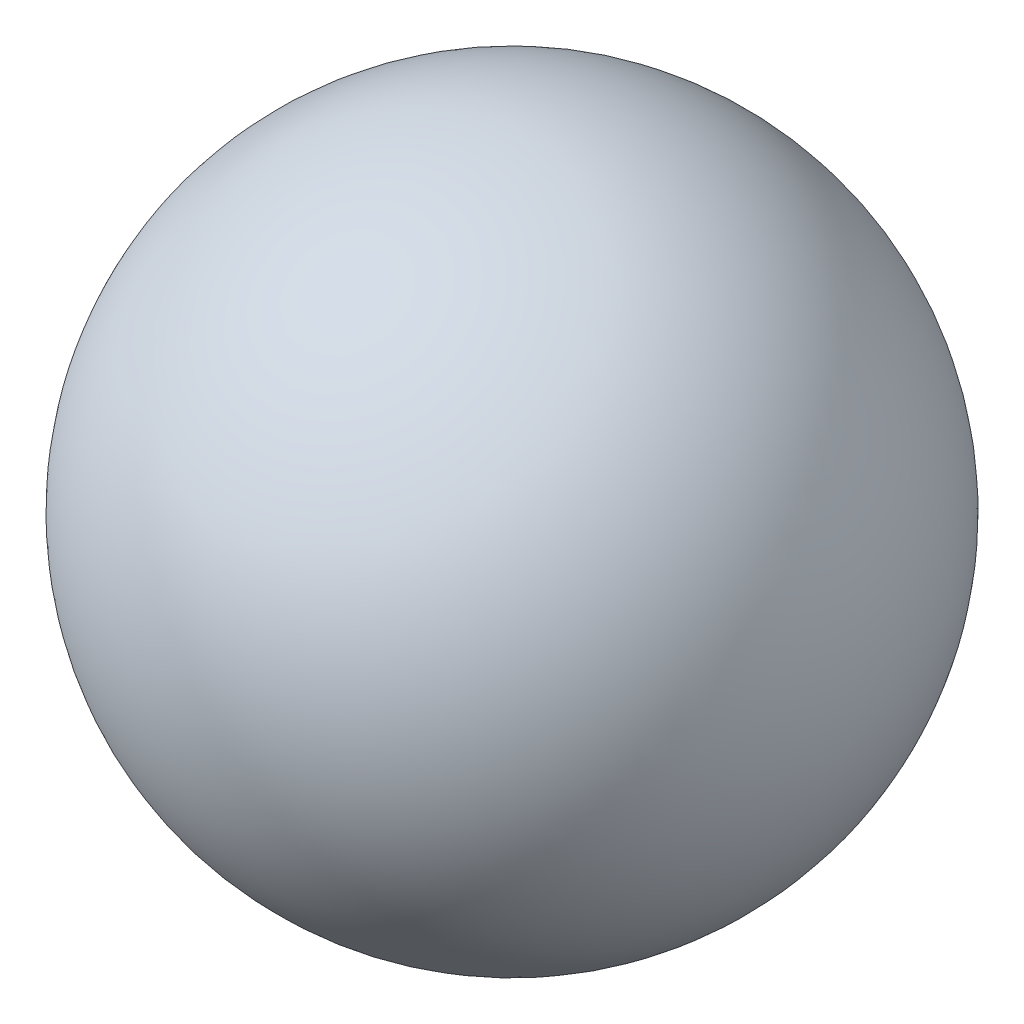
ISO-10303-21;
HEADER;
FILE_DESCRIPTION(('STEP AP214'),'2;1');
FILE_NAME('part.step','',(''),(''),'','','');
FILE_SCHEMA(('AUTOMOTIVE_DESIGN { 1 0 10303 214 1 1 1 1 }'));
ENDSEC;
DATA;
#1=APPLICATION_CONTEXT('core data for automotive mechanical design processes');
#2=APPLICATION_PROTOCOL_DEFINITION('international standard','automotive_design',2000,#1);
#3=PRODUCT_CONTEXT('',#1,'mechanical');
#4=PRODUCT('Part','Part','',(#3));
#5=PRODUCT_RELATED_PRODUCT_CATEGORY('part','',(#4));
#6=PRODUCT_DEFINITION_FORMATION('','',#4);
#7=PRODUCT_DEFINITION_CONTEXT('part definition',#1,'design');
#8=PRODUCT_DEFINITION('design','',#6,#7);
#9=PRODUCT_DEFINITION_SHAPE('','',#8);
#10=(LENGTH_UNIT() NAMED_UNIT(*) SI_UNIT(.MILLI.,.METRE.));
#11=(NAMED_UNIT(*) PLANE_ANGLE_UNIT() SI_UNIT($,.RADIAN.));
#12=(NAMED_UNIT(*) SI_UNIT($,.STERADIAN.) SOLID_ANGLE_UNIT());
#13=UNCERTAINTY_MEASURE_WITH_UNIT(LENGTH_MEASURE(1.E-05),#10,'distance_accuracy_value','');
#14=(GEOMETRIC_REPRESENTATION_CONTEXT(3) GLOBAL_UNCERTAINTY_ASSIGNED_CONTEXT((#13)) GLOBAL_UNIT_ASSIGNED_CONTEXT((#10,
#11,#12)) REPRESENTATION_CONTEXT('',''));
#15=CARTESIAN_POINT('',(0.,0.,0.));
#16=DIRECTION('',(0.,0.,1.));
#17=DIRECTION('',(1.,0.,0.));
#18=AXIS2_PLACEMENT_3D('',#15,#16,#17);
#19=CARTESIAN_POINT('',(0.,0.,0.));
#20=DIRECTION('',(-1.,0.,0.));
#21=DIRECTION('',(0.,0.,-1.));
#22=AXIS2_PLACEMENT_3D('',#19,#20,#21);
#23=SPHERICAL_SURFACE('',#22,274.32);
#24=CARTESIAN_POINT('',(-274.32,0.,0.));
#25=VERTEX_POINT('',#24);
#26=VERTEX_LOOP('',#25);
#27=FACE_BOUND('',#26,.T.);
#28=ADVANCED_FACE('F34',(#27),#23,.T.);
#29=CLOSED_SHELL('',(#28));
#30=CARTESIAN_POINT('',(0.,0.,0.));
#31=DIRECTION('',(-1.,0.,0.));
#32=DIRECTION('',(0.,0.,-1.));
#33=AXIS2_PLACEMENT_3D('',#30,#31,#32);
#34=SPHERICAL_SURFACE('',#33,271.145);
#35=CARTESIAN_POINT('',(-271.145,0.,0.));
#36=VERTEX_POINT('',#35);
#37=VERTEX_LOOP('',#36);
#38=FACE_BOUND('',#37,.T.);
#39=ADVANCED_FACE('F36',(#38),#34,.F.);
#40=CLOSED_SHELL('',(#39));
#41=ORIENTED_CLOSED_SHELL('',*,#40,.T.);
#42=BREP_WITH_VOIDS('B2',#29,(#41));
#43=ADVANCED_BREP_SHAPE_REPRESENTATION('',(#18,#42),#14);
#44=SHAPE_DEFINITION_REPRESENTATION(#9,#43);
ENDSEC;
END-ISO-10303-21;
